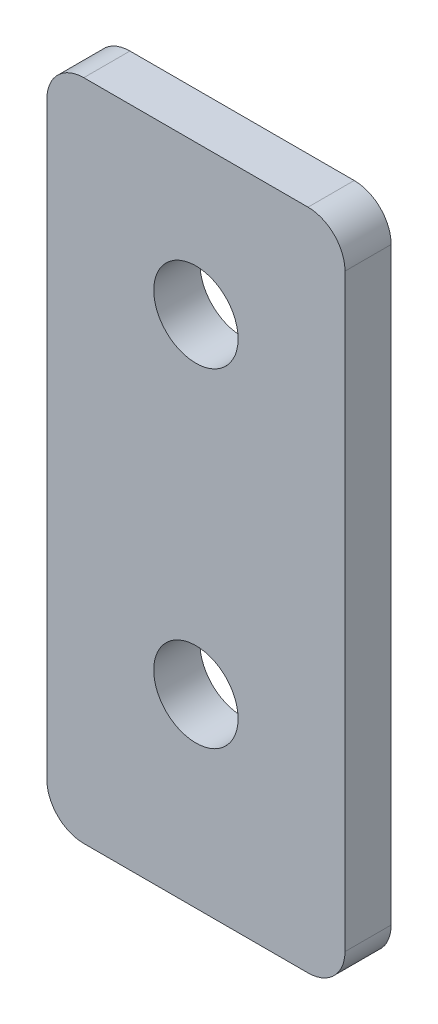
ISO-10303-21;
HEADER;
FILE_DESCRIPTION(('STEP AP214'),'2;1');
FILE_NAME('part.step','',(''),(''),'','','');
FILE_SCHEMA(('AUTOMOTIVE_DESIGN { 1 0 10303 214 1 1 1 1 }'));
ENDSEC;
DATA;
#1=APPLICATION_CONTEXT('core data for automotive mechanical design processes');
#2=APPLICATION_PROTOCOL_DEFINITION('international standard','automotive_design',2000,#1);
#3=PRODUCT_CONTEXT('',#1,'mechanical');
#4=PRODUCT('Part','Part','',(#3));
#5=PRODUCT_RELATED_PRODUCT_CATEGORY('part','',(#4));
#6=PRODUCT_DEFINITION_FORMATION('','',#4);
#7=PRODUCT_DEFINITION_CONTEXT('part definition',#1,'design');
#8=PRODUCT_DEFINITION('design','',#6,#7);
#9=PRODUCT_DEFINITION_SHAPE('','',#8);
#10=(LENGTH_UNIT() NAMED_UNIT(*) SI_UNIT(.MILLI.,.METRE.));
#11=(NAMED_UNIT(*) PLANE_ANGLE_UNIT() SI_UNIT($,.RADIAN.));
#12=(NAMED_UNIT(*) SI_UNIT($,.STERADIAN.) SOLID_ANGLE_UNIT());
#13=UNCERTAINTY_MEASURE_WITH_UNIT(LENGTH_MEASURE(1.E-05),#10,'distance_accuracy_value','');
#14=(GEOMETRIC_REPRESENTATION_CONTEXT(3) GLOBAL_UNCERTAINTY_ASSIGNED_CONTEXT((#13)) GLOBAL_UNIT_ASSIGNED_CONTEXT((#10,
#11,#12)) REPRESENTATION_CONTEXT('',''));
#15=CARTESIAN_POINT('',(0.,0.,0.));
#16=DIRECTION('',(0.,0.,1.));
#17=DIRECTION('',(1.,0.,0.));
#18=AXIS2_PLACEMENT_3D('',#15,#16,#17);
#19=CARTESIAN_POINT('',(8.78900045783992,-24.0876487015086,3.175));
#20=DIRECTION('',(-1.,0.,0.));
#21=DIRECTION('',(0.,-1.,0.));
#22=AXIS2_PLACEMENT_3D('',#19,#20,#21);
#23=PLANE('',#22);
#24=DIRECTION('',(0.,1.,0.));
#25=VECTOR('',#24,1.);
#26=CARTESIAN_POINT('',(8.78900045783992,0.,0.));
#27=LINE('',#26,#25);
#28=CARTESIAN_POINT('',(8.78900045783992,18.9714845545429,0.));
#29=VERTEX_POINT('',#28);
#30=CARTESIAN_POINT('',(8.78900045783992,-21.5476487015086,0.));
#31=VERTEX_POINT('',#30);
#32=EDGE_CURVE('E125',#29,#31,#27,.F.);
#33=ORIENTED_EDGE('',*,*,#32,.T.);
#34=DIRECTION('',(0.,0.,1.));
#35=VECTOR('',#34,1.);
#36=CARTESIAN_POINT('',(8.78900045783992,-21.5476487015086,3.175));
#37=LINE('',#36,#35);
#38=CARTESIAN_POINT('',(8.78900045783992,-21.5476487015086,3.175));
#39=VERTEX_POINT('',#38);
#40=EDGE_CURVE('E130',#31,#39,#37,.T.);
#41=ORIENTED_EDGE('',*,*,#40,.T.);
#42=DIRECTION('',(0.,-1.,0.));
#43=VECTOR('',#42,1.);
#44=CARTESIAN_POINT('',(8.78900045783992,-24.0876487015086,3.175));
#45=LINE('',#44,#43);
#46=CARTESIAN_POINT('',(8.78900045783992,18.9714845545429,3.175));
#47=VERTEX_POINT('',#46);
#48=EDGE_CURVE('E142',#47,#39,#45,.T.);
#49=ORIENTED_EDGE('',*,*,#48,.F.);
#50=DIRECTION('',(0.,0.,1.));
#51=VECTOR('',#50,1.);
#52=CARTESIAN_POINT('',(8.78900045783992,18.9714845545429,3.175));
#53=LINE('',#52,#51);
#54=EDGE_CURVE('E132',#47,#29,#53,.F.);
#55=ORIENTED_EDGE('',*,*,#54,.T.);
#56=EDGE_LOOP('',(#33,#41,#49,#55));
#57=FACE_BOUND('',#56,.T.);
#58=ADVANCED_FACE('F39',(#57),#23,.T.);
#59=CARTESIAN_POINT('',(29.2868004578399,-24.0876487015086,3.175));
#60=DIRECTION('',(0.,-1.,0.));
#61=DIRECTION('',(1.,0.,0.));
#62=AXIS2_PLACEMENT_3D('',#59,#60,#61);
#63=PLANE('',#62);
#64=DIRECTION('',(1.,0.,0.));
#65=VECTOR('',#64,1.);
#66=CARTESIAN_POINT('',(0.,-24.0876487015086,0.));
#67=LINE('',#66,#65);
#68=CARTESIAN_POINT('',(11.3290004578399,-24.0876487015086,0.));
#69=VERTEX_POINT('',#68);
#70=CARTESIAN_POINT('',(26.7468004578399,-24.0876487015086,0.));
#71=VERTEX_POINT('',#70);
#72=EDGE_CURVE('E110',#69,#71,#67,.T.);
#73=ORIENTED_EDGE('',*,*,#72,.T.);
#74=DIRECTION('',(0.,0.,1.));
#75=VECTOR('',#74,1.);
#76=CARTESIAN_POINT('',(26.7468004578399,-24.0876487015086,3.175));
#77=LINE('',#76,#75);
#78=CARTESIAN_POINT('',(26.7468004578399,-24.0876487015086,3.175));
#79=VERTEX_POINT('',#78);
#80=EDGE_CURVE('E116',#71,#79,#77,.T.);
#81=ORIENTED_EDGE('',*,*,#80,.T.);
#82=DIRECTION('',(1.,0.,0.));
#83=VECTOR('',#82,1.);
#84=CARTESIAN_POINT('',(29.2868004578399,-24.0876487015086,3.175));
#85=LINE('',#84,#83);
#86=CARTESIAN_POINT('',(11.3290004578399,-24.0876487015086,3.175));
#87=VERTEX_POINT('',#86);
#88=EDGE_CURVE('E113',#87,#79,#85,.T.);
#89=ORIENTED_EDGE('',*,*,#88,.F.);
#90=DIRECTION('',(0.,0.,1.));
#91=VECTOR('',#90,1.);
#92=CARTESIAN_POINT('',(11.3290004578399,-24.0876487015086,3.175));
#93=LINE('',#92,#91);
#94=EDGE_CURVE('E106',#87,#69,#93,.F.);
#95=ORIENTED_EDGE('',*,*,#94,.T.);
#96=EDGE_LOOP('',(#73,#81,#89,#95));
#97=FACE_BOUND('',#96,.T.);
#98=ADVANCED_FACE('F108',(#97),#63,.T.);
#99=CARTESIAN_POINT('',(29.2868004578399,-24.0876487015086,3.175));
#100=DIRECTION('',(1.,0.,0.));
#101=DIRECTION('',(0.,1.,0.));
#102=AXIS2_PLACEMENT_3D('',#99,#100,#101);
#103=PLANE('',#102);
#104=DIRECTION('',(0.,1.,0.));
#105=VECTOR('',#104,1.);
#106=CARTESIAN_POINT('',(29.2868004578399,-24.0876487015086,3.175));
#107=LINE('',#106,#105);
#108=CARTESIAN_POINT('',(29.2868004578399,-21.5476487015086,3.175));
#109=VERTEX_POINT('',#108);
#110=CARTESIAN_POINT('',(29.2868004578399,18.9714845545429,3.175));
#111=VERTEX_POINT('',#110);
#112=EDGE_CURVE('E124',#109,#111,#107,.T.);
#113=ORIENTED_EDGE('',*,*,#112,.F.);
#114=DIRECTION('',(0.,0.,1.));
#115=VECTOR('',#114,1.);
#116=CARTESIAN_POINT('',(29.2868004578399,-21.5476487015086,3.175));
#117=LINE('',#116,#115);
#118=CARTESIAN_POINT('',(29.2868004578399,-21.5476487015086,0.));
#119=VERTEX_POINT('',#118);
#120=EDGE_CURVE('E172',#109,#119,#117,.F.);
#121=ORIENTED_EDGE('',*,*,#120,.T.);
#122=DIRECTION('',(0.,1.,0.));
#123=VECTOR('',#122,1.);
#124=CARTESIAN_POINT('',(29.2868004578399,0.,0.));
#125=LINE('',#124,#123);
#126=CARTESIAN_POINT('',(29.2868004578399,18.9714845545429,0.));
#127=VERTEX_POINT('',#126);
#128=EDGE_CURVE('E155',#119,#127,#125,.T.);
#129=ORIENTED_EDGE('',*,*,#128,.T.);
#130=DIRECTION('',(0.,0.,1.));
#131=VECTOR('',#130,1.);
#132=CARTESIAN_POINT('',(29.2868004578399,18.9714845545429,3.175));
#133=LINE('',#132,#131);
#134=EDGE_CURVE('E169',#127,#111,#133,.T.);
#135=ORIENTED_EDGE('',*,*,#134,.T.);
#136=EDGE_LOOP('',(#113,#121,#129,#135));
#137=FACE_BOUND('',#136,.T.);
#138=ADVANCED_FACE('F178',(#137),#103,.T.);
#139=CARTESIAN_POINT('',(29.2868004578399,21.5114845545429,3.175));
#140=DIRECTION('',(0.,1.,0.));
#141=DIRECTION('',(-1.,0.,0.));
#142=AXIS2_PLACEMENT_3D('',#139,#140,#141);
#143=PLANE('',#142);
#144=DIRECTION('',(1.,0.,0.));
#145=VECTOR('',#144,1.);
#146=CARTESIAN_POINT('',(0.,21.5114845545429,0.));
#147=LINE('',#146,#145);
#148=CARTESIAN_POINT('',(26.7468004578399,21.5114845545429,0.));
#149=VERTEX_POINT('',#148);
#150=CARTESIAN_POINT('',(11.3290004578399,21.5114845545429,0.));
#151=VERTEX_POINT('',#150);
#152=EDGE_CURVE('E157',#149,#151,#147,.F.);
#153=ORIENTED_EDGE('',*,*,#152,.T.);
#154=DIRECTION('',(0.,0.,1.));
#155=VECTOR('',#154,1.);
#156=CARTESIAN_POINT('',(11.3290004578399,21.5114845545429,3.175));
#157=LINE('',#156,#155);
#158=CARTESIAN_POINT('',(11.3290004578399,21.5114845545429,3.175));
#159=VERTEX_POINT('',#158);
#160=EDGE_CURVE('E11',#151,#159,#157,.T.);
#161=ORIENTED_EDGE('',*,*,#160,.T.);
#162=DIRECTION('',(-1.,0.,0.));
#163=VECTOR('',#162,1.);
#164=CARTESIAN_POINT('',(29.2868004578399,21.5114845545429,3.175));
#165=LINE('',#164,#163);
#166=CARTESIAN_POINT('',(26.7468004578399,21.5114845545429,3.175));
#167=VERTEX_POINT('',#166);
#168=EDGE_CURVE('E149',#167,#159,#165,.T.);
#169=ORIENTED_EDGE('',*,*,#168,.F.);
#170=DIRECTION('',(0.,0.,1.));
#171=VECTOR('',#170,1.);
#172=CARTESIAN_POINT('',(26.7468004578399,21.5114845545429,3.175));
#173=LINE('',#172,#171);
#174=EDGE_CURVE('E47',#167,#149,#173,.F.);
#175=ORIENTED_EDGE('',*,*,#174,.T.);
#176=EDGE_LOOP('',(#153,#161,#169,#175));
#177=FACE_BOUND('',#176,.T.);
#178=ADVANCED_FACE('F181',(#177),#143,.T.);
#179=CARTESIAN_POINT('',(0.,0.,3.175));
#180=DIRECTION('',(0.,0.,1.));
#181=DIRECTION('',(1.,0.,0.));
#182=AXIS2_PLACEMENT_3D('',#179,#180,#181);
#183=PLANE('',#182);
#184=CARTESIAN_POINT('',(19.0379004578399,-11.3495487015086,3.175));
#185=DIRECTION('',(0.,0.,1.));
#186=DIRECTION('',(1.,0.,0.));
#187=AXIS2_PLACEMENT_3D('',#184,#185,#186);
#188=CIRCLE('',#187,2.9);
#189=CARTESIAN_POINT('',(21.9379004578399,-11.3495487015086,3.175));
#190=VERTEX_POINT('',#189);
#191=EDGE_CURVE('E220',#190,#190,#188,.T.);
#192=ORIENTED_EDGE('',*,*,#191,.F.);
#193=EDGE_LOOP('',(#192));
#194=FACE_BOUND('',#193,.T.);
#195=CARTESIAN_POINT('',(19.0379004578399,11.2625845545428,3.175));
#196=DIRECTION('',(0.,0.,1.));
#197=DIRECTION('',(1.,0.,0.));
#198=AXIS2_PLACEMENT_3D('',#195,#196,#197);
#199=CIRCLE('',#198,2.9);
#200=CARTESIAN_POINT('',(21.9379004578399,11.2625845545428,3.175));
#201=VERTEX_POINT('',#200);
#202=EDGE_CURVE('E214',#201,#201,#199,.T.);
#203=ORIENTED_EDGE('',*,*,#202,.F.);
#204=EDGE_LOOP('',(#203));
#205=FACE_BOUND('',#204,.T.);
#206=ORIENTED_EDGE('',*,*,#88,.T.);
#207=CARTESIAN_POINT('',(26.7468004578399,-21.5476487015086,3.175));
#208=DIRECTION('',(0.,0.,1.));
#209=DIRECTION('',(1.,0.,0.));
#210=AXIS2_PLACEMENT_3D('',#207,#208,#209);
#211=CIRCLE('',#210,2.54);
#212=EDGE_CURVE('E167',#79,#109,#211,.T.);
#213=ORIENTED_EDGE('',*,*,#212,.T.);
#214=ORIENTED_EDGE('',*,*,#112,.T.);
#215=CARTESIAN_POINT('',(26.7468004578399,18.9714845545429,3.175));
#216=DIRECTION('',(0.,0.,1.));
#217=DIRECTION('',(1.,0.,0.));
#218=AXIS2_PLACEMENT_3D('',#215,#216,#217);
#219=CIRCLE('',#218,2.54);
#220=EDGE_CURVE('E163',#111,#167,#219,.T.);
#221=ORIENTED_EDGE('',*,*,#220,.T.);
#222=ORIENTED_EDGE('',*,*,#168,.T.);
#223=CARTESIAN_POINT('',(11.3290004578399,18.9714845545429,3.175));
#224=DIRECTION('',(0.,0.,1.));
#225=DIRECTION('',(1.,0.,0.));
#226=AXIS2_PLACEMENT_3D('',#223,#224,#225);
#227=CIRCLE('',#226,2.54);
#228=EDGE_CURVE('E148',#159,#47,#227,.T.);
#229=ORIENTED_EDGE('',*,*,#228,.T.);
#230=ORIENTED_EDGE('',*,*,#48,.T.);
#231=CARTESIAN_POINT('',(11.3290004578399,-21.5476487015086,3.175));
#232=DIRECTION('',(0.,0.,1.));
#233=DIRECTION('',(1.,0.,0.));
#234=AXIS2_PLACEMENT_3D('',#231,#232,#233);
#235=CIRCLE('',#234,2.54);
#236=EDGE_CURVE('E146',#39,#87,#235,.T.);
#237=ORIENTED_EDGE('',*,*,#236,.T.);
#238=EDGE_LOOP('',(#206,#213,#214,#221,#222,#229,#230,#237));
#239=FACE_BOUND('',#238,.T.);
#240=ADVANCED_FACE('F145',(#194,#205,#239),#183,.T.);
#241=CARTESIAN_POINT('',(0.,0.,0.));
#242=DIRECTION('',(0.,0.,1.));
#243=DIRECTION('',(1.,0.,0.));
#244=AXIS2_PLACEMENT_3D('',#241,#242,#243);
#245=PLANE('',#244);
#246=CARTESIAN_POINT('',(19.0379004578399,-11.3495487015086,0.));
#247=DIRECTION('',(0.,0.,1.));
#248=DIRECTION('',(1.,0.,0.));
#249=AXIS2_PLACEMENT_3D('',#246,#247,#248);
#250=CIRCLE('',#249,2.9);
#251=CARTESIAN_POINT('',(21.9379004578399,-11.3495487015086,0.));
#252=VERTEX_POINT('',#251);
#253=EDGE_CURVE('E217',#252,#252,#250,.T.);
#254=ORIENTED_EDGE('',*,*,#253,.T.);
#255=EDGE_LOOP('',(#254));
#256=FACE_BOUND('',#255,.T.);
#257=CARTESIAN_POINT('',(19.0379004578399,11.2625845545428,0.));
#258=DIRECTION('',(0.,0.,1.));
#259=DIRECTION('',(1.,0.,0.));
#260=AXIS2_PLACEMENT_3D('',#257,#258,#259);
#261=CIRCLE('',#260,2.9);
#262=CARTESIAN_POINT('',(21.9379004578399,11.2625845545428,0.));
#263=VERTEX_POINT('',#262);
#264=EDGE_CURVE('E158',#263,#263,#261,.T.);
#265=ORIENTED_EDGE('',*,*,#264,.T.);
#266=EDGE_LOOP('',(#265));
#267=FACE_BOUND('',#266,.T.);
#268=ORIENTED_EDGE('',*,*,#128,.F.);
#269=CARTESIAN_POINT('',(26.7468004578399,-21.5476487015086,0.));
#270=DIRECTION('',(0.,0.,1.));
#271=DIRECTION('',(1.,0.,0.));
#272=AXIS2_PLACEMENT_3D('',#269,#270,#271);
#273=CIRCLE('',#272,2.54);
#274=EDGE_CURVE('E123',#119,#71,#273,.F.);
#275=ORIENTED_EDGE('',*,*,#274,.T.);
#276=ORIENTED_EDGE('',*,*,#72,.F.);
#277=CARTESIAN_POINT('',(11.3290004578399,-21.5476487015086,0.));
#278=DIRECTION('',(0.,0.,1.));
#279=DIRECTION('',(1.,0.,0.));
#280=AXIS2_PLACEMENT_3D('',#277,#278,#279);
#281=CIRCLE('',#280,2.54);
#282=EDGE_CURVE('E120',#69,#31,#281,.F.);
#283=ORIENTED_EDGE('',*,*,#282,.T.);
#284=ORIENTED_EDGE('',*,*,#32,.F.);
#285=CARTESIAN_POINT('',(11.3290004578399,18.9714845545429,0.));
#286=DIRECTION('',(0.,0.,1.));
#287=DIRECTION('',(1.,0.,0.));
#288=AXIS2_PLACEMENT_3D('',#285,#286,#287);
#289=CIRCLE('',#288,2.54);
#290=EDGE_CURVE('E54',#29,#151,#289,.F.);
#291=ORIENTED_EDGE('',*,*,#290,.T.);
#292=ORIENTED_EDGE('',*,*,#152,.F.);
#293=CARTESIAN_POINT('',(26.7468004578399,18.9714845545429,0.));
#294=DIRECTION('',(0.,0.,1.));
#295=DIRECTION('',(1.,0.,0.));
#296=AXIS2_PLACEMENT_3D('',#293,#294,#295);
#297=CIRCLE('',#296,2.54);
#298=EDGE_CURVE('E134',#149,#127,#297,.F.);
#299=ORIENTED_EDGE('',*,*,#298,.T.);
#300=EDGE_LOOP('',(#268,#275,#276,#283,#284,#291,#292,#299));
#301=FACE_BOUND('',#300,.T.);
#302=ADVANCED_FACE('F119',(#256,#267,#301),#245,.F.);
#303=CARTESIAN_POINT('',(19.0379004578399,11.2625845545428,3.175));
#304=DIRECTION('',(0.,0.,1.));
#305=DIRECTION('',(1.,0.,0.));
#306=AXIS2_PLACEMENT_3D('',#303,#304,#305);
#307=CYLINDRICAL_SURFACE('',#306,2.9);
#308=ORIENTED_EDGE('',*,*,#264,.F.);
#309=EDGE_LOOP('',(#308));
#310=FACE_BOUND('',#309,.T.);
#311=ORIENTED_EDGE('',*,*,#202,.T.);
#312=EDGE_LOOP('',(#311));
#313=FACE_BOUND('',#312,.T.);
#314=ADVANCED_FACE('F204',(#310,#313),#307,.F.);
#315=CARTESIAN_POINT('',(26.7468004578399,-21.5476487015086,3.175));
#316=DIRECTION('',(0.,0.,1.));
#317=DIRECTION('',(1.,0.,0.));
#318=AXIS2_PLACEMENT_3D('',#315,#316,#317);
#319=CYLINDRICAL_SURFACE('',#318,2.54);
#320=ORIENTED_EDGE('',*,*,#274,.F.);
#321=ORIENTED_EDGE('',*,*,#120,.F.);
#322=ORIENTED_EDGE('',*,*,#212,.F.);
#323=ORIENTED_EDGE('',*,*,#80,.F.);
#324=EDGE_LOOP('',(#320,#321,#322,#323));
#325=FACE_BOUND('',#324,.T.);
#326=ADVANCED_FACE('F191',(#325),#319,.T.);
#327=CARTESIAN_POINT('',(11.3290004578399,-21.5476487015086,3.175));
#328=DIRECTION('',(0.,0.,1.));
#329=DIRECTION('',(1.,0.,0.));
#330=AXIS2_PLACEMENT_3D('',#327,#328,#329);
#331=CYLINDRICAL_SURFACE('',#330,2.54);
#332=ORIENTED_EDGE('',*,*,#282,.F.);
#333=ORIENTED_EDGE('',*,*,#94,.F.);
#334=ORIENTED_EDGE('',*,*,#236,.F.);
#335=ORIENTED_EDGE('',*,*,#40,.F.);
#336=EDGE_LOOP('',(#332,#333,#334,#335));
#337=FACE_BOUND('',#336,.T.);
#338=ADVANCED_FACE('F128',(#337),#331,.T.);
#339=CARTESIAN_POINT('',(11.3290004578399,18.9714845545429,3.175));
#340=DIRECTION('',(0.,0.,1.));
#341=DIRECTION('',(1.,0.,0.));
#342=AXIS2_PLACEMENT_3D('',#339,#340,#341);
#343=CYLINDRICAL_SURFACE('',#342,2.54);
#344=ORIENTED_EDGE('',*,*,#290,.F.);
#345=ORIENTED_EDGE('',*,*,#54,.F.);
#346=ORIENTED_EDGE('',*,*,#228,.F.);
#347=ORIENTED_EDGE('',*,*,#160,.F.);
#348=EDGE_LOOP('',(#344,#345,#346,#347));
#349=FACE_BOUND('',#348,.T.);
#350=ADVANCED_FACE('F184',(#349),#343,.T.);
#351=CARTESIAN_POINT('',(26.7468004578399,18.9714845545429,3.175));
#352=DIRECTION('',(0.,0.,1.));
#353=DIRECTION('',(1.,0.,0.));
#354=AXIS2_PLACEMENT_3D('',#351,#352,#353);
#355=CYLINDRICAL_SURFACE('',#354,2.54);
#356=ORIENTED_EDGE('',*,*,#298,.F.);
#357=ORIENTED_EDGE('',*,*,#174,.F.);
#358=ORIENTED_EDGE('',*,*,#220,.F.);
#359=ORIENTED_EDGE('',*,*,#134,.F.);
#360=EDGE_LOOP('',(#356,#357,#358,#359));
#361=FACE_BOUND('',#360,.T.);
#362=ADVANCED_FACE('F41',(#361),#355,.T.);
#363=CARTESIAN_POINT('',(19.0379004578399,-11.3495487015086,3.175));
#364=DIRECTION('',(0.,0.,1.));
#365=DIRECTION('',(1.,0.,0.));
#366=AXIS2_PLACEMENT_3D('',#363,#364,#365);
#367=CYLINDRICAL_SURFACE('',#366,2.9);
#368=ORIENTED_EDGE('',*,*,#253,.F.);
#369=EDGE_LOOP('',(#368));
#370=FACE_BOUND('',#369,.T.);
#371=ORIENTED_EDGE('',*,*,#191,.T.);
#372=EDGE_LOOP('',(#371));
#373=FACE_BOUND('',#372,.T.);
#374=ADVANCED_FACE('F190',(#370,#373),#367,.F.);
#375=CLOSED_SHELL('',(#58,#98,#138,#178,#240,#302,#314,#326,#338,#350,#362,#374));
#376=MANIFOLD_SOLID_BREP('B2',#375);
#377=ADVANCED_BREP_SHAPE_REPRESENTATION('',(#18,#376),#14);
#378=SHAPE_DEFINITION_REPRESENTATION(#9,#377);
ENDSEC;
END-ISO-10303-21;
